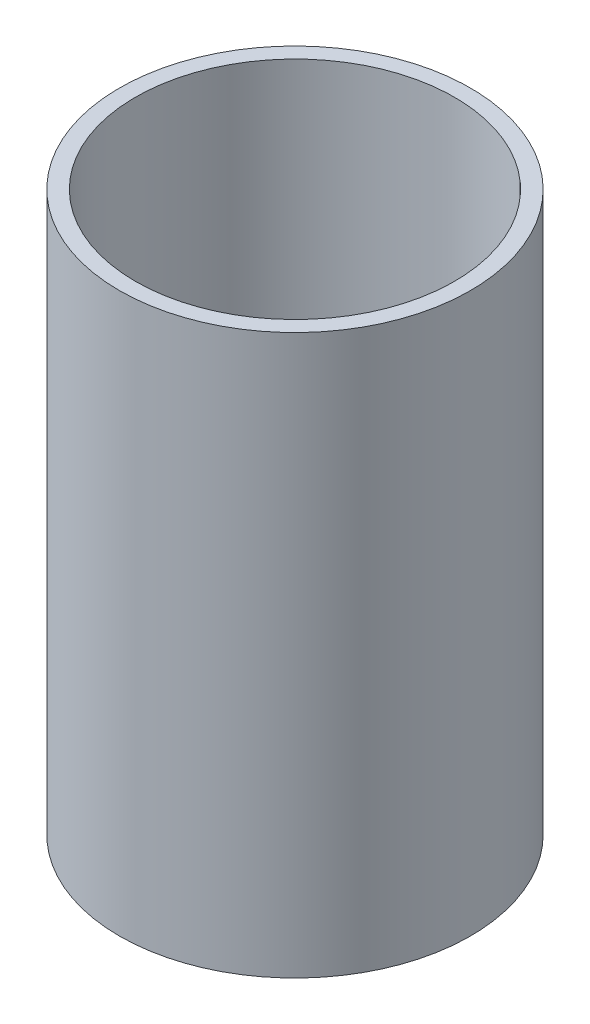
ISO-10303-21;
HEADER;
FILE_DESCRIPTION(('STEP AP214'),'2;1');
FILE_NAME('part.step','',(''),(''),'','','');
FILE_SCHEMA(('AUTOMOTIVE_DESIGN { 1 0 10303 214 1 1 1 1 }'));
ENDSEC;
DATA;
#1=APPLICATION_CONTEXT('core data for automotive mechanical design processes');
#2=APPLICATION_PROTOCOL_DEFINITION('international standard','automotive_design',2000,#1);
#3=PRODUCT_CONTEXT('',#1,'mechanical');
#4=PRODUCT('Part','Part','',(#3));
#5=PRODUCT_RELATED_PRODUCT_CATEGORY('part','',(#4));
#6=PRODUCT_DEFINITION_FORMATION('','',#4);
#7=PRODUCT_DEFINITION_CONTEXT('part definition',#1,'design');
#8=PRODUCT_DEFINITION('design','',#6,#7);
#9=PRODUCT_DEFINITION_SHAPE('','',#8);
#10=(LENGTH_UNIT() NAMED_UNIT(*) SI_UNIT(.MILLI.,.METRE.));
#11=(NAMED_UNIT(*) PLANE_ANGLE_UNIT() SI_UNIT($,.RADIAN.));
#12=(NAMED_UNIT(*) SI_UNIT($,.STERADIAN.) SOLID_ANGLE_UNIT());
#13=UNCERTAINTY_MEASURE_WITH_UNIT(LENGTH_MEASURE(1.E-05),#10,'distance_accuracy_value','');
#14=(GEOMETRIC_REPRESENTATION_CONTEXT(3) GLOBAL_UNCERTAINTY_ASSIGNED_CONTEXT((#13)) GLOBAL_UNIT_ASSIGNED_CONTEXT((#10,
#11,#12)) REPRESENTATION_CONTEXT('',''));
#15=CARTESIAN_POINT('',(0.,0.,0.));
#16=DIRECTION('',(0.,0.,1.));
#17=DIRECTION('',(1.,0.,0.));
#18=AXIS2_PLACEMENT_3D('',#15,#16,#17);
#19=CARTESIAN_POINT('',(0.,222.501157175804,0.));
#20=DIRECTION('',(0.,1.,0.));
#21=DIRECTION('',(0.,0.,1.));
#22=AXIS2_PLACEMENT_3D('',#19,#20,#21);
#23=PLANE('',#22);
#24=CARTESIAN_POINT('',(0.,222.501157175804,0.));
#25=DIRECTION('',(0.,1.,0.));
#26=DIRECTION('',(0.,0.,1.));
#27=AXIS2_PLACEMENT_3D('',#24,#25,#26);
#28=CIRCLE('',#27,69.85);
#29=CARTESIAN_POINT('',(0.,222.501157175804,69.85));
#30=VERTEX_POINT('',#29);
#31=EDGE_CURVE('E10',#30,#30,#28,.T.);
#32=ORIENTED_EDGE('',*,*,#31,.T.);
#33=EDGE_LOOP('',(#32));
#34=FACE_BOUND('',#33,.T.);
#35=CARTESIAN_POINT('',(0.,222.501157175804,0.));
#36=DIRECTION('',(0.,1.,0.));
#37=DIRECTION('',(0.,0.,1.));
#38=AXIS2_PLACEMENT_3D('',#35,#36,#37);
#39=CIRCLE('',#38,63.5);
#40=CARTESIAN_POINT('',(0.,222.501157175804,63.5));
#41=VERTEX_POINT('',#40);
#42=EDGE_CURVE('E45',#41,#41,#39,.T.);
#43=ORIENTED_EDGE('',*,*,#42,.F.);
#44=EDGE_LOOP('',(#43));
#45=FACE_BOUND('',#44,.T.);
#46=ADVANCED_FACE('F34',(#34,#45),#23,.T.);
#47=CARTESIAN_POINT('',(0.,0.,0.));
#48=DIRECTION('',(0.,1.,0.));
#49=DIRECTION('',(0.,0.,1.));
#50=AXIS2_PLACEMENT_3D('',#47,#48,#49);
#51=PLANE('',#50);
#52=CARTESIAN_POINT('',(0.,0.,0.));
#53=DIRECTION('',(0.,1.,0.));
#54=DIRECTION('',(0.,0.,1.));
#55=AXIS2_PLACEMENT_3D('',#52,#53,#54);
#56=CIRCLE('',#55,69.85);
#57=CARTESIAN_POINT('',(0.,0.,69.85));
#58=VERTEX_POINT('',#57);
#59=EDGE_CURVE('E38',#58,#58,#56,.T.);
#60=ORIENTED_EDGE('',*,*,#59,.F.);
#61=EDGE_LOOP('',(#60));
#62=FACE_BOUND('',#61,.T.);
#63=CARTESIAN_POINT('',(0.,0.,0.));
#64=DIRECTION('',(0.,1.,0.));
#65=DIRECTION('',(0.,0.,1.));
#66=AXIS2_PLACEMENT_3D('',#63,#64,#65);
#67=CIRCLE('',#66,63.5);
#68=CARTESIAN_POINT('',(0.,0.,63.5));
#69=VERTEX_POINT('',#68);
#70=EDGE_CURVE('E47',#69,#69,#67,.T.);
#71=ORIENTED_EDGE('',*,*,#70,.T.);
#72=EDGE_LOOP('',(#71));
#73=FACE_BOUND('',#72,.T.);
#74=ADVANCED_FACE('F57',(#62,#73),#51,.F.);
#75=CARTESIAN_POINT('',(0.,222.501157175804,0.));
#76=DIRECTION('',(0.,-1.,0.));
#77=DIRECTION('',(0.,0.,-1.));
#78=AXIS2_PLACEMENT_3D('',#75,#76,#77);
#79=CYLINDRICAL_SURFACE('',#78,69.85);
#80=ORIENTED_EDGE('',*,*,#31,.F.);
#81=EDGE_LOOP('',(#80));
#82=FACE_BOUND('',#81,.T.);
#83=ORIENTED_EDGE('',*,*,#59,.T.);
#84=EDGE_LOOP('',(#83));
#85=FACE_BOUND('',#84,.T.);
#86=ADVANCED_FACE('F36',(#82,#85),#79,.T.);
#87=CARTESIAN_POINT('',(0.,222.501157175804,0.));
#88=DIRECTION('',(0.,-1.,0.));
#89=DIRECTION('',(0.,0.,-1.));
#90=AXIS2_PLACEMENT_3D('',#87,#88,#89);
#91=CYLINDRICAL_SURFACE('',#90,63.5);
#92=ORIENTED_EDGE('',*,*,#42,.T.);
#93=EDGE_LOOP('',(#92));
#94=FACE_BOUND('',#93,.T.);
#95=ORIENTED_EDGE('',*,*,#70,.F.);
#96=EDGE_LOOP('',(#95));
#97=FACE_BOUND('',#96,.T.);
#98=ADVANCED_FACE('F53',(#94,#97),#91,.F.);
#99=CLOSED_SHELL('',(#46,#74,#86,#98));
#100=MANIFOLD_SOLID_BREP('B2',#99);
#101=ADVANCED_BREP_SHAPE_REPRESENTATION('',(#18,#100),#14);
#102=SHAPE_DEFINITION_REPRESENTATION(#9,#101);
ENDSEC;
END-ISO-10303-21;
